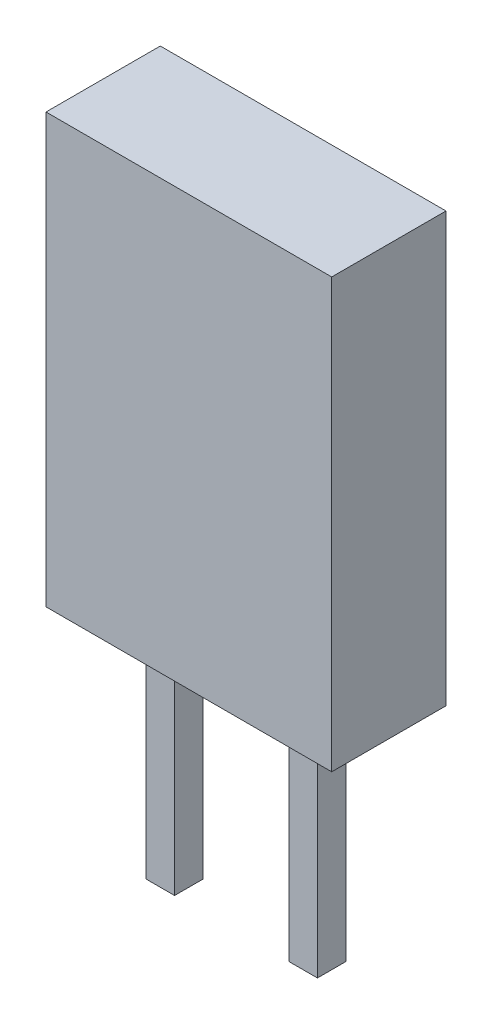
ISO-10303-21;
HEADER;
FILE_DESCRIPTION(('STEP AP214'),'2;1');
FILE_NAME('part.step','',(''),(''),'','','');
FILE_SCHEMA(('AUTOMOTIVE_DESIGN { 1 0 10303 214 1 1 1 1 }'));
ENDSEC;
DATA;
#1=APPLICATION_CONTEXT('core data for automotive mechanical design processes');
#2=APPLICATION_PROTOCOL_DEFINITION('international standard','automotive_design',2000,#1);
#3=PRODUCT_CONTEXT('',#1,'mechanical');
#4=PRODUCT('Part','Part','',(#3));
#5=PRODUCT_RELATED_PRODUCT_CATEGORY('part','',(#4));
#6=PRODUCT_DEFINITION_FORMATION('','',#4);
#7=PRODUCT_DEFINITION_CONTEXT('part definition',#1,'design');
#8=PRODUCT_DEFINITION('design','',#6,#7);
#9=PRODUCT_DEFINITION_SHAPE('','',#8);
#10=(LENGTH_UNIT() NAMED_UNIT(*) SI_UNIT(.MILLI.,.METRE.));
#11=(NAMED_UNIT(*) PLANE_ANGLE_UNIT() SI_UNIT($,.RADIAN.));
#12=(NAMED_UNIT(*) SI_UNIT($,.STERADIAN.) SOLID_ANGLE_UNIT());
#13=UNCERTAINTY_MEASURE_WITH_UNIT(LENGTH_MEASURE(1.E-05),#10,'distance_accuracy_value','');
#14=(GEOMETRIC_REPRESENTATION_CONTEXT(3) GLOBAL_UNCERTAINTY_ASSIGNED_CONTEXT((#13)) GLOBAL_UNIT_ASSIGNED_CONTEXT((#10,
#11,#12)) REPRESENTATION_CONTEXT('',''));
#15=CARTESIAN_POINT('',(0.,0.,0.));
#16=DIRECTION('',(0.,0.,1.));
#17=DIRECTION('',(1.,0.,0.));
#18=AXIS2_PLACEMENT_3D('',#15,#16,#17);
#19=CARTESIAN_POINT('',(-0.2,-1.75,0.25));
#20=DIRECTION('',(-0.876215908676647,-0.481918749772156,0.));
#21=DIRECTION('',(0.481918749772156,-0.876215908676647,0.));
#22=AXIS2_PLACEMENT_3D('',#19,#20,#21);
#23=PLANE('',#22);
#24=DIRECTION('',(-0.481918749772156,0.876215908676647,0.));
#25=VECTOR('',#24,1.);
#26=CARTESIAN_POINT('',(-0.2,-1.75,-0.25));
#27=LINE('',#26,#25);
#28=CARTESIAN_POINT('',(-0.2,-1.75,-0.25));
#29=VERTEX_POINT('',#28);
#30=CARTESIAN_POINT('',(-1.3,0.249999999999999,-0.25));
#31=VERTEX_POINT('',#30);
#32=EDGE_CURVE('E146',#29,#31,#27,.T.);
#33=ORIENTED_EDGE('',*,*,#32,.T.);
#34=DIRECTION('',(0.,0.,-1.));
#35=VECTOR('',#34,1.);
#36=CARTESIAN_POINT('',(-1.3,0.249999999999999,0.25));
#37=LINE('',#36,#35);
#38=CARTESIAN_POINT('',(-1.3,0.249999999999999,0.25));
#39=VERTEX_POINT('',#38);
#40=EDGE_CURVE('E128',#39,#31,#37,.T.);
#41=ORIENTED_EDGE('',*,*,#40,.F.);
#42=DIRECTION('',(-0.481918749772156,0.876215908676647,0.));
#43=VECTOR('',#42,1.);
#44=CARTESIAN_POINT('',(-0.2,-1.75,0.25));
#45=LINE('',#44,#43);
#46=CARTESIAN_POINT('',(-0.2,-1.75,0.25));
#47=VERTEX_POINT('',#46);
#48=EDGE_CURVE('E134',#47,#39,#45,.T.);
#49=ORIENTED_EDGE('',*,*,#48,.F.);
#50=DIRECTION('',(0.,0.,-1.));
#51=VECTOR('',#50,1.);
#52=CARTESIAN_POINT('',(-0.2,-1.75,0.25));
#53=LINE('',#52,#51);
#54=EDGE_CURVE('E190',#47,#29,#53,.T.);
#55=ORIENTED_EDGE('',*,*,#54,.T.);
#56=EDGE_LOOP('',(#33,#41,#49,#55));
#57=FACE_BOUND('',#56,.T.);
#58=ADVANCED_FACE('F46',(#57),#23,.F.);
#59=CARTESIAN_POINT('',(-1.3,0.249999999999999,0.25));
#60=DIRECTION('',(1.,0.,0.));
#61=DIRECTION('',(0.,1.,0.));
#62=AXIS2_PLACEMENT_3D('',#59,#60,#61);
#63=PLANE('',#62);
#64=DIRECTION('',(0.,-1.,0.));
#65=VECTOR('',#64,1.);
#66=CARTESIAN_POINT('',(-1.3,0.249999999999999,-0.25));
#67=LINE('',#66,#65);
#68=CARTESIAN_POINT('',(-1.3,-1.66715728752538,-0.25));
#69=VERTEX_POINT('',#68);
#70=EDGE_CURVE('E199',#31,#69,#67,.T.);
#71=ORIENTED_EDGE('',*,*,#70,.T.);
#72=DIRECTION('',(0.,0.,-1.));
#73=VECTOR('',#72,1.);
#74=CARTESIAN_POINT('',(-1.3,-1.66715728752538,0.25));
#75=LINE('',#74,#73);
#76=CARTESIAN_POINT('',(-1.3,-1.66715728752538,0.25));
#77=VERTEX_POINT('',#76);
#78=EDGE_CURVE('E131',#69,#77,#75,.F.);
#79=ORIENTED_EDGE('',*,*,#78,.T.);
#80=DIRECTION('',(0.,-1.,0.));
#81=VECTOR('',#80,1.);
#82=CARTESIAN_POINT('',(-1.3,0.249999999999999,0.25));
#83=LINE('',#82,#81);
#84=EDGE_CURVE('E123',#39,#77,#83,.T.);
#85=ORIENTED_EDGE('',*,*,#84,.F.);
#86=ORIENTED_EDGE('',*,*,#40,.T.);
#87=EDGE_LOOP('',(#71,#79,#85,#86));
#88=FACE_BOUND('',#87,.T.);
#89=ADVANCED_FACE('F126',(#88),#63,.F.);
#90=CARTESIAN_POINT('',(-1.3,-1.75,0.25));
#91=DIRECTION('',(0.707106781186548,-0.707106781186547,0.));
#92=DIRECTION('',(0.707106781186547,0.707106781186548,0.));
#93=AXIS2_PLACEMENT_3D('',#90,#91,#92);
#94=PLANE('',#93);
#95=DIRECTION('',(-0.707106781186547,-0.707106781186548,0.));
#96=VECTOR('',#95,1.);
#97=CARTESIAN_POINT('',(-1.3,-1.75,0.25));
#98=LINE('',#97,#96);
#99=CARTESIAN_POINT('',(-1.35857864376269,-1.80857864376269,0.25));
#100=VERTEX_POINT('',#99);
#101=CARTESIAN_POINT('',(-1.44142135623731,-1.89142135623731,0.25));
#102=VERTEX_POINT('',#101);
#103=EDGE_CURVE('E133',#100,#102,#98,.T.);
#104=ORIENTED_EDGE('',*,*,#103,.F.);
#105=DIRECTION('',(0.,0.,-1.));
#106=VECTOR('',#105,1.);
#107=CARTESIAN_POINT('',(-1.35857864376269,-1.80857864376269,-0.25));
#108=LINE('',#107,#106);
#109=CARTESIAN_POINT('',(-1.35857864376269,-1.80857864376269,-0.25));
#110=VERTEX_POINT('',#109);
#111=EDGE_CURVE('E150',#100,#110,#108,.T.);
#112=ORIENTED_EDGE('',*,*,#111,.T.);
#113=DIRECTION('',(-0.707106781186547,-0.707106781186548,0.));
#114=VECTOR('',#113,1.);
#115=CARTESIAN_POINT('',(-1.3,-1.75,-0.25));
#116=LINE('',#115,#114);
#117=CARTESIAN_POINT('',(-1.44142135623731,-1.89142135623731,-0.25));
#118=VERTEX_POINT('',#117);
#119=EDGE_CURVE('E201',#110,#118,#116,.T.);
#120=ORIENTED_EDGE('',*,*,#119,.T.);
#121=DIRECTION('',(0.,0.,-1.));
#122=VECTOR('',#121,1.);
#123=CARTESIAN_POINT('',(-1.44142135623731,-1.89142135623731,0.25));
#124=LINE('',#123,#122);
#125=EDGE_CURVE('E147',#118,#102,#124,.F.);
#126=ORIENTED_EDGE('',*,*,#125,.T.);
#127=EDGE_LOOP('',(#104,#112,#120,#126));
#128=FACE_BOUND('',#127,.T.);
#129=ADVANCED_FACE('F223',(#128),#94,.F.);
#130=CARTESIAN_POINT('',(-1.5,-3.75,0.25));
#131=DIRECTION('',(1.,0.,0.));
#132=DIRECTION('',(0.,1.,0.));
#133=AXIS2_PLACEMENT_3D('',#130,#131,#132);
#134=PLANE('',#133);
#135=DIRECTION('',(0.,-1.,0.));
#136=VECTOR('',#135,1.);
#137=CARTESIAN_POINT('',(-1.5,-1.95,0.25));
#138=LINE('',#137,#136);
#139=CARTESIAN_POINT('',(-1.5,-2.03284271247462,0.25));
#140=VERTEX_POINT('',#139);
#141=CARTESIAN_POINT('',(-1.5,-7.75,0.25));
#142=VERTEX_POINT('',#141);
#143=EDGE_CURVE('E216',#140,#142,#138,.T.);
#144=ORIENTED_EDGE('',*,*,#143,.F.);
#145=DIRECTION('',(0.,0.,-1.));
#146=VECTOR('',#145,1.);
#147=CARTESIAN_POINT('',(-1.5,-2.03284271247462,0.25));
#148=LINE('',#147,#146);
#149=CARTESIAN_POINT('',(-1.5,-2.03284271247462,-0.25));
#150=VERTEX_POINT('',#149);
#151=EDGE_CURVE('E160',#140,#150,#148,.T.);
#152=ORIENTED_EDGE('',*,*,#151,.T.);
#153=DIRECTION('',(0.,-1.,0.));
#154=VECTOR('',#153,1.);
#155=CARTESIAN_POINT('',(-1.5,-3.75,-0.25));
#156=LINE('',#155,#154);
#157=CARTESIAN_POINT('',(-1.5,-7.75,-0.25));
#158=VERTEX_POINT('',#157);
#159=EDGE_CURVE('E204',#150,#158,#156,.T.);
#160=ORIENTED_EDGE('',*,*,#159,.T.);
#161=DIRECTION('',(0.,0.,-1.));
#162=VECTOR('',#161,1.);
#163=CARTESIAN_POINT('',(-1.5,-7.75,0.25));
#164=LINE('',#163,#162);
#165=EDGE_CURVE('E148',#142,#158,#164,.T.);
#166=ORIENTED_EDGE('',*,*,#165,.F.);
#167=EDGE_LOOP('',(#144,#152,#160,#166));
#168=FACE_BOUND('',#167,.T.);
#169=ADVANCED_FACE('F214',(#168),#134,.F.);
#170=CARTESIAN_POINT('',(-1.5,-7.75,0.25));
#171=DIRECTION('',(0.,1.,0.));
#172=DIRECTION('',(0.,0.,1.));
#173=AXIS2_PLACEMENT_3D('',#170,#171,#172);
#174=PLANE('',#173);
#175=DIRECTION('',(1.,0.,0.));
#176=VECTOR('',#175,1.);
#177=CARTESIAN_POINT('',(-1.5,-7.75,-0.25));
#178=LINE('',#177,#176);
#179=CARTESIAN_POINT('',(-0.999999999999999,-7.75,-0.25));
#180=VERTEX_POINT('',#179);
#181=EDGE_CURVE('E186',#158,#180,#178,.T.);
#182=ORIENTED_EDGE('',*,*,#181,.T.);
#183=DIRECTION('',(0.,0.,-1.));
#184=VECTOR('',#183,1.);
#185=CARTESIAN_POINT('',(-0.999999999999999,-7.75,0.25));
#186=LINE('',#185,#184);
#187=CARTESIAN_POINT('',(-0.999999999999999,-7.75,0.25));
#188=VERTEX_POINT('',#187);
#189=EDGE_CURVE('E153',#188,#180,#186,.T.);
#190=ORIENTED_EDGE('',*,*,#189,.F.);
#191=DIRECTION('',(1.,0.,0.));
#192=VECTOR('',#191,1.);
#193=CARTESIAN_POINT('',(-1.5,-7.75,0.25));
#194=LINE('',#193,#192);
#195=EDGE_CURVE('E194',#142,#188,#194,.T.);
#196=ORIENTED_EDGE('',*,*,#195,.F.);
#197=ORIENTED_EDGE('',*,*,#165,.T.);
#198=EDGE_LOOP('',(#182,#190,#196,#197));
#199=FACE_BOUND('',#198,.T.);
#200=ADVANCED_FACE('F208',(#199),#174,.F.);
#201=CARTESIAN_POINT('',(-1.,-3.75,0.25));
#202=DIRECTION('',(-1.,0.,0.));
#203=DIRECTION('',(0.,-1.,0.));
#204=AXIS2_PLACEMENT_3D('',#201,#202,#203);
#205=PLANE('',#204);
#206=DIRECTION('',(0.,1.,0.));
#207=VECTOR('',#206,1.);
#208=CARTESIAN_POINT('',(-1.,-3.75,-0.25));
#209=LINE('',#208,#207);
#210=CARTESIAN_POINT('',(-0.999999999999999,-2.10615528128088,-0.25));
#211=VERTEX_POINT('',#210);
#212=EDGE_CURVE('E179',#180,#211,#209,.T.);
#213=ORIENTED_EDGE('',*,*,#212,.T.);
#214=DIRECTION('',(0.,0.,-1.));
#215=VECTOR('',#214,1.);
#216=CARTESIAN_POINT('',(-0.999999999999999,-2.10615528128088,0.25));
#217=LINE('',#216,#215);
#218=CARTESIAN_POINT('',(-1.,-2.10615528128088,0.25));
#219=VERTEX_POINT('',#218);
#220=EDGE_CURVE('E67',#211,#219,#217,.F.);
#221=ORIENTED_EDGE('',*,*,#220,.T.);
#222=DIRECTION('',(0.,1.,0.));
#223=VECTOR('',#222,1.);
#224=CARTESIAN_POINT('',(-0.999999999999999,-7.75,0.25));
#225=LINE('',#224,#223);
#226=EDGE_CURVE('E191',#188,#219,#225,.T.);
#227=ORIENTED_EDGE('',*,*,#226,.F.);
#228=ORIENTED_EDGE('',*,*,#189,.T.);
#229=EDGE_LOOP('',(#213,#221,#227,#228));
#230=FACE_BOUND('',#229,.T.);
#231=ADVANCED_FACE('F184',(#230),#205,.F.);
#232=CARTESIAN_POINT('',(-0.999999999999999,-1.95,0.25));
#233=DIRECTION('',(-0.242535625036333,0.970142500145332,0.));
#234=DIRECTION('',(-0.970142500145332,-0.242535625036333,0.));
#235=AXIS2_PLACEMENT_3D('',#232,#233,#234);
#236=PLANE('',#235);
#237=DIRECTION('',(0.970142500145332,0.242535625036333,0.));
#238=VECTOR('',#237,1.);
#239=CARTESIAN_POINT('',(-0.999999999999999,-1.95,0.25));
#240=LINE('',#239,#238);
#241=CARTESIAN_POINT('',(-0.848507125007266,-1.91212678125182,0.25));
#242=VERTEX_POINT('',#241);
#243=EDGE_CURVE('E139',#242,#47,#240,.T.);
#244=ORIENTED_EDGE('',*,*,#243,.F.);
#245=DIRECTION('',(0.,0.,-1.));
#246=VECTOR('',#245,1.);
#247=CARTESIAN_POINT('',(-0.848507125007266,-1.91212678125182,-0.25));
#248=LINE('',#247,#246);
#249=CARTESIAN_POINT('',(-0.848507125007266,-1.91212678125182,-0.25));
#250=VERTEX_POINT('',#249);
#251=EDGE_CURVE('E167',#242,#250,#248,.T.);
#252=ORIENTED_EDGE('',*,*,#251,.T.);
#253=DIRECTION('',(0.970142500145332,0.242535625036333,0.));
#254=VECTOR('',#253,1.);
#255=CARTESIAN_POINT('',(-0.999999999999999,-1.95,-0.25));
#256=LINE('',#255,#254);
#257=EDGE_CURVE('E143',#250,#29,#256,.T.);
#258=ORIENTED_EDGE('',*,*,#257,.T.);
#259=ORIENTED_EDGE('',*,*,#54,.F.);
#260=EDGE_LOOP('',(#244,#252,#258,#259));
#261=FACE_BOUND('',#260,.T.);
#262=ADVANCED_FACE('F189',(#261),#236,.F.);
#263=CARTESIAN_POINT('',(0.,0.,0.25));
#264=DIRECTION('',(0.,0.,-1.));
#265=DIRECTION('',(-1.,0.,0.));
#266=AXIS2_PLACEMENT_3D('',#263,#264,#265);
#267=PLANE('',#266);
#268=ORIENTED_EDGE('',*,*,#103,.T.);
#269=CARTESIAN_POINT('',(-1.3,-2.03284271247462,0.25));
#270=DIRECTION('',(0.,0.,-1.));
#271=DIRECTION('',(-1.,0.,0.));
#272=AXIS2_PLACEMENT_3D('',#269,#270,#271);
#273=CIRCLE('',#272,0.2);
#274=EDGE_CURVE('E165',#102,#140,#273,.F.);
#275=ORIENTED_EDGE('',*,*,#274,.T.);
#276=ORIENTED_EDGE('',*,*,#143,.T.);
#277=ORIENTED_EDGE('',*,*,#195,.T.);
#278=ORIENTED_EDGE('',*,*,#226,.T.);
#279=CARTESIAN_POINT('',(-0.799999999999999,-2.10615528128088,0.25));
#280=DIRECTION('',(0.,0.,-1.));
#281=DIRECTION('',(-1.,0.,0.));
#282=AXIS2_PLACEMENT_3D('',#279,#280,#281);
#283=CIRCLE('',#282,0.2);
#284=EDGE_CURVE('E12',#219,#242,#283,.T.);
#285=ORIENTED_EDGE('',*,*,#284,.T.);
#286=ORIENTED_EDGE('',*,*,#243,.T.);
#287=ORIENTED_EDGE('',*,*,#48,.T.);
#288=ORIENTED_EDGE('',*,*,#84,.T.);
#289=CARTESIAN_POINT('',(-1.5,-1.66715728752538,0.25));
#290=DIRECTION('',(0.,0.,-1.));
#291=DIRECTION('',(-1.,0.,0.));
#292=AXIS2_PLACEMENT_3D('',#289,#290,#291);
#293=CIRCLE('',#292,0.2);
#294=EDGE_CURVE('E173',#77,#100,#293,.T.);
#295=ORIENTED_EDGE('',*,*,#294,.T.);
#296=EDGE_LOOP('',(#268,#275,#276,#277,#278,#285,#286,#287,#288,#295));
#297=FACE_BOUND('',#296,.T.);
#298=ADVANCED_FACE('F138',(#297),#267,.F.);
#299=CARTESIAN_POINT('',(0.,0.,-0.25));
#300=DIRECTION('',(0.,0.,-1.));
#301=DIRECTION('',(-1.,0.,0.));
#302=AXIS2_PLACEMENT_3D('',#299,#300,#301);
#303=PLANE('',#302);
#304=ORIENTED_EDGE('',*,*,#159,.F.);
#305=CARTESIAN_POINT('',(-1.3,-2.03284271247462,-0.25));
#306=DIRECTION('',(0.,0.,-1.));
#307=DIRECTION('',(-1.,0.,0.));
#308=AXIS2_PLACEMENT_3D('',#305,#306,#307);
#309=CIRCLE('',#308,0.2);
#310=EDGE_CURVE('E163',#150,#118,#309,.T.);
#311=ORIENTED_EDGE('',*,*,#310,.T.);
#312=ORIENTED_EDGE('',*,*,#119,.F.);
#313=CARTESIAN_POINT('',(-1.5,-1.66715728752538,-0.25));
#314=DIRECTION('',(0.,0.,-1.));
#315=DIRECTION('',(-1.,0.,0.));
#316=AXIS2_PLACEMENT_3D('',#313,#314,#315);
#317=CIRCLE('',#316,0.2);
#318=EDGE_CURVE('E171',#110,#69,#317,.F.);
#319=ORIENTED_EDGE('',*,*,#318,.T.);
#320=ORIENTED_EDGE('',*,*,#70,.F.);
#321=ORIENTED_EDGE('',*,*,#32,.F.);
#322=ORIENTED_EDGE('',*,*,#257,.F.);
#323=CARTESIAN_POINT('',(-0.799999999999999,-2.10615528128088,-0.25));
#324=DIRECTION('',(0.,0.,-1.));
#325=DIRECTION('',(-1.,0.,0.));
#326=AXIS2_PLACEMENT_3D('',#323,#324,#325);
#327=CIRCLE('',#326,0.2);
#328=EDGE_CURVE('E54',#250,#211,#327,.F.);
#329=ORIENTED_EDGE('',*,*,#328,.T.);
#330=ORIENTED_EDGE('',*,*,#212,.F.);
#331=ORIENTED_EDGE('',*,*,#181,.F.);
#332=EDGE_LOOP('',(#304,#311,#312,#319,#320,#321,#322,#329,#330,#331));
#333=FACE_BOUND('',#332,.T.);
#334=ADVANCED_FACE('F177',(#333),#303,.T.);
#335=CARTESIAN_POINT('',(-1.5,-1.66715728752538,0.25));
#336=DIRECTION('',(0.,0.,1.));
#337=DIRECTION('',(1.,0.,0.));
#338=AXIS2_PLACEMENT_3D('',#335,#336,#337);
#339=CYLINDRICAL_SURFACE('',#338,0.2);
#340=ORIENTED_EDGE('',*,*,#294,.F.);
#341=ORIENTED_EDGE('',*,*,#78,.F.);
#342=ORIENTED_EDGE('',*,*,#318,.F.);
#343=ORIENTED_EDGE('',*,*,#111,.F.);
#344=EDGE_LOOP('',(#340,#341,#342,#343));
#345=FACE_BOUND('',#344,.T.);
#346=ADVANCED_FACE('F228',(#345),#339,.F.);
#347=CARTESIAN_POINT('',(-1.3,-2.03284271247462,0.25));
#348=DIRECTION('',(0.,0.,-1.));
#349=DIRECTION('',(-1.,0.,0.));
#350=AXIS2_PLACEMENT_3D('',#347,#348,#349);
#351=CYLINDRICAL_SURFACE('',#350,0.2);
#352=ORIENTED_EDGE('',*,*,#274,.F.);
#353=ORIENTED_EDGE('',*,*,#125,.F.);
#354=ORIENTED_EDGE('',*,*,#310,.F.);
#355=ORIENTED_EDGE('',*,*,#151,.F.);
#356=EDGE_LOOP('',(#352,#353,#354,#355));
#357=FACE_BOUND('',#356,.T.);
#358=ADVANCED_FACE('F219',(#357),#351,.T.);
#359=CARTESIAN_POINT('',(-0.799999999999999,-2.10615528128088,0.25));
#360=DIRECTION('',(0.,0.,1.));
#361=DIRECTION('',(1.,0.,0.));
#362=AXIS2_PLACEMENT_3D('',#359,#360,#361);
#363=CYLINDRICAL_SURFACE('',#362,0.2);
#364=ORIENTED_EDGE('',*,*,#284,.F.);
#365=ORIENTED_EDGE('',*,*,#220,.F.);
#366=ORIENTED_EDGE('',*,*,#328,.F.);
#367=ORIENTED_EDGE('',*,*,#251,.F.);
#368=EDGE_LOOP('',(#364,#365,#366,#367));
#369=FACE_BOUND('',#368,.T.);
#370=ADVANCED_FACE('F48',(#369),#363,.F.);
#371=CLOSED_SHELL('',(#58,#89,#129,#169,#200,#231,#262,#298,#334,#346,#358,#370));
#372=MANIFOLD_SOLID_BREP('B2',#371);
#373=CARTESIAN_POINT('',(1.5,-3.75,0.25));
#374=DIRECTION('',(-1.,0.,0.));
#375=DIRECTION('',(0.,-1.,0.));
#376=AXIS2_PLACEMENT_3D('',#373,#374,#375);
#377=PLANE('',#376);
#378=DIRECTION('',(0.,1.,0.));
#379=VECTOR('',#378,1.);
#380=CARTESIAN_POINT('',(1.5,-3.75,-0.25));
#381=LINE('',#380,#379);
#382=CARTESIAN_POINT('',(1.5,-7.75,-0.25));
#383=VERTEX_POINT('',#382);
#384=CARTESIAN_POINT('',(1.5,-2.03284271247462,-0.25));
#385=VERTEX_POINT('',#384);
#386=EDGE_CURVE('E463',#383,#385,#381,.T.);
#387=ORIENTED_EDGE('',*,*,#386,.T.);
#388=DIRECTION('',(0.,0.,-1.));
#389=VECTOR('',#388,1.);
#390=CARTESIAN_POINT('',(1.5,-2.03284271247462,0.25));
#391=LINE('',#390,#389);
#392=CARTESIAN_POINT('',(1.5,-2.03284271247462,0.25));
#393=VERTEX_POINT('',#392);
#394=EDGE_CURVE('E511',#385,#393,#391,.F.);
#395=ORIENTED_EDGE('',*,*,#394,.T.);
#396=DIRECTION('',(0.,1.,0.));
#397=VECTOR('',#396,1.);
#398=CARTESIAN_POINT('',(1.5,-7.75,0.25));
#399=LINE('',#398,#397);
#400=CARTESIAN_POINT('',(1.5,-7.75,0.25));
#401=VERTEX_POINT('',#400);
#402=EDGE_CURVE('E483',#401,#393,#399,.T.);
#403=ORIENTED_EDGE('',*,*,#402,.F.);
#404=DIRECTION('',(0.,0.,-1.));
#405=VECTOR('',#404,1.);
#406=CARTESIAN_POINT('',(1.5,-7.75,0.25));
#407=LINE('',#406,#405);
#408=EDGE_CURVE('E462',#401,#383,#407,.T.);
#409=ORIENTED_EDGE('',*,*,#408,.T.);
#410=EDGE_LOOP('',(#387,#395,#403,#409));
#411=FACE_BOUND('',#410,.T.);
#412=ADVANCED_FACE('F341',(#411),#377,.F.);
#413=CARTESIAN_POINT('',(1.3,-1.75,0.25));
#414=DIRECTION('',(-0.707106781186547,-0.707106781186547,0.));
#415=DIRECTION('',(0.707106781186548,-0.707106781186548,0.));
#416=AXIS2_PLACEMENT_3D('',#413,#414,#415);
#417=PLANE('',#416);
#418=DIRECTION('',(-0.707106781186548,0.707106781186548,0.));
#419=VECTOR('',#418,1.);
#420=CARTESIAN_POINT('',(1.3,-1.75,-0.25));
#421=LINE('',#420,#419);
#422=CARTESIAN_POINT('',(1.44142135623731,-1.89142135623731,-0.25));
#423=VERTEX_POINT('',#422);
#424=CARTESIAN_POINT('',(1.35857864376269,-1.80857864376269,-0.25));
#425=VERTEX_POINT('',#424);
#426=EDGE_CURVE('E466',#423,#425,#421,.T.);
#427=ORIENTED_EDGE('',*,*,#426,.T.);
#428=DIRECTION('',(0.,0.,-1.));
#429=VECTOR('',#428,1.);
#430=CARTESIAN_POINT('',(1.35857864376269,-1.80857864376269,0.25));
#431=LINE('',#430,#429);
#432=CARTESIAN_POINT('',(1.35857864376269,-1.80857864376269,0.25));
#433=VERTEX_POINT('',#432);
#434=EDGE_CURVE('E509',#425,#433,#431,.F.);
#435=ORIENTED_EDGE('',*,*,#434,.T.);
#436=DIRECTION('',(-0.707106781186548,0.707106781186548,0.));
#437=VECTOR('',#436,1.);
#438=CARTESIAN_POINT('',(1.3,-1.75,0.25));
#439=LINE('',#438,#437);
#440=CARTESIAN_POINT('',(1.44142135623731,-1.89142135623731,0.25));
#441=VERTEX_POINT('',#440);
#442=EDGE_CURVE('E436',#441,#433,#439,.T.);
#443=ORIENTED_EDGE('',*,*,#442,.F.);
#444=DIRECTION('',(0.,0.,-1.));
#445=VECTOR('',#444,1.);
#446=CARTESIAN_POINT('',(1.44142135623731,-1.89142135623731,0.25));
#447=LINE('',#446,#445);
#448=EDGE_CURVE('E506',#441,#423,#447,.T.);
#449=ORIENTED_EDGE('',*,*,#448,.T.);
#450=EDGE_LOOP('',(#427,#435,#443,#449));
#451=FACE_BOUND('',#450,.T.);
#452=ADVANCED_FACE('F568',(#451),#417,.F.);
#453=CARTESIAN_POINT('',(1.3,-1.75,0.25));
#454=DIRECTION('',(-1.,0.,0.));
#455=DIRECTION('',(0.,0.,1.));
#456=AXIS2_PLACEMENT_3D('',#453,#454,#455);
#457=PLANE('',#456);
#458=DIRECTION('',(0.,1.,0.));
#459=VECTOR('',#458,1.);
#460=CARTESIAN_POINT('',(1.3,-1.75,0.25));
#461=LINE('',#460,#459);
#462=CARTESIAN_POINT('',(1.3,-1.66715728752538,0.25));
#463=VERTEX_POINT('',#462);
#464=CARTESIAN_POINT('',(1.3,0.25,0.25));
#465=VERTEX_POINT('',#464);
#466=EDGE_CURVE('E426',#463,#465,#461,.T.);
#467=ORIENTED_EDGE('',*,*,#466,.F.);
#468=DIRECTION('',(0.,0.,-1.));
#469=VECTOR('',#468,1.);
#470=CARTESIAN_POINT('',(1.3,-1.66715728752538,-0.25));
#471=LINE('',#470,#469);
#472=CARTESIAN_POINT('',(1.3,-1.66715728752538,-0.25));
#473=VERTEX_POINT('',#472);
#474=EDGE_CURVE('E504',#463,#473,#471,.T.);
#475=ORIENTED_EDGE('',*,*,#474,.T.);
#476=DIRECTION('',(0.,1.,0.));
#477=VECTOR('',#476,1.);
#478=CARTESIAN_POINT('',(1.3,-1.75,-0.25));
#479=LINE('',#478,#477);
#480=CARTESIAN_POINT('',(1.3,0.25,-0.25));
#481=VERTEX_POINT('',#480);
#482=EDGE_CURVE('E442',#473,#481,#479,.T.);
#483=ORIENTED_EDGE('',*,*,#482,.T.);
#484=DIRECTION('',(0.,0.,-1.));
#485=VECTOR('',#484,1.);
#486=CARTESIAN_POINT('',(1.3,0.25,0.25));
#487=LINE('',#486,#485);
#488=EDGE_CURVE('E439',#465,#481,#487,.T.);
#489=ORIENTED_EDGE('',*,*,#488,.F.);
#490=EDGE_LOOP('',(#467,#475,#483,#489));
#491=FACE_BOUND('',#490,.T.);
#492=ADVANCED_FACE('F440',(#491),#457,.F.);
#493=CARTESIAN_POINT('',(1.3,0.25,0.25));
#494=DIRECTION('',(0.,-1.,0.));
#495=DIRECTION('',(1.,0.,0.));
#496=AXIS2_PLACEMENT_3D('',#493,#494,#495);
#497=PLANE('',#496);
#498=DIRECTION('',(-1.,0.,0.));
#499=VECTOR('',#498,1.);
#500=CARTESIAN_POINT('',(1.3,0.25,-0.25));
#501=LINE('',#500,#499);
#502=CARTESIAN_POINT('',(-1.2,0.249999999999999,-0.25));
#503=VERTEX_POINT('',#502);
#504=EDGE_CURVE('E470',#481,#503,#501,.T.);
#505=ORIENTED_EDGE('',*,*,#504,.T.);
#506=DIRECTION('',(0.,0.,-1.));
#507=VECTOR('',#506,1.);
#508=CARTESIAN_POINT('',(-1.2,0.249999999999999,0.25));
#509=LINE('',#508,#507);
#510=CARTESIAN_POINT('',(-1.2,0.249999999999999,0.25));
#511=VERTEX_POINT('',#510);
#512=EDGE_CURVE('E446',#511,#503,#509,.T.);
#513=ORIENTED_EDGE('',*,*,#512,.F.);
#514=DIRECTION('',(-1.,0.,0.));
#515=VECTOR('',#514,1.);
#516=CARTESIAN_POINT('',(1.3,0.25,0.25));
#517=LINE('',#516,#515);
#518=EDGE_CURVE('E431',#465,#511,#517,.T.);
#519=ORIENTED_EDGE('',*,*,#518,.F.);
#520=ORIENTED_EDGE('',*,*,#488,.T.);
#521=EDGE_LOOP('',(#505,#513,#519,#520));
#522=FACE_BOUND('',#521,.T.);
#523=ADVANCED_FACE('F448',(#522),#497,.F.);
#524=CARTESIAN_POINT('',(-1.2,0.249999999999999,0.25));
#525=DIRECTION('',(0.791285001392167,0.611447501075766,0.));
#526=DIRECTION('',(-0.611447501075766,0.791285001392167,0.));
#527=AXIS2_PLACEMENT_3D('',#524,#525,#526);
#528=PLANE('',#527);
#529=DIRECTION('',(0.611447501075766,-0.791285001392167,0.));
#530=VECTOR('',#529,1.);
#531=CARTESIAN_POINT('',(-1.2,0.249999999999999,-0.25));
#532=LINE('',#531,#530);
#533=CARTESIAN_POINT('',(0.439950977438983,-1.87228950021515,-0.25));
#534=VERTEX_POINT('',#533);
#535=EDGE_CURVE('E472',#503,#534,#532,.T.);
#536=ORIENTED_EDGE('',*,*,#535,.T.);
#537=DIRECTION('',(0.,0.,-1.));
#538=VECTOR('',#537,1.);
#539=CARTESIAN_POINT('',(0.439950977438983,-1.87228950021515,0.25));
#540=LINE('',#539,#538);
#541=CARTESIAN_POINT('',(0.439950977438983,-1.87228950021515,0.25));
#542=VERTEX_POINT('',#541);
#543=EDGE_CURVE('E498',#534,#542,#540,.F.);
#544=ORIENTED_EDGE('',*,*,#543,.T.);
#545=DIRECTION('',(0.611447501075766,-0.791285001392167,0.));
#546=VECTOR('',#545,1.);
#547=CARTESIAN_POINT('',(-1.2,0.249999999999999,0.25));
#548=LINE('',#547,#546);
#549=EDGE_CURVE('E451',#511,#542,#548,.T.);
#550=ORIENTED_EDGE('',*,*,#549,.F.);
#551=ORIENTED_EDGE('',*,*,#512,.T.);
#552=EDGE_LOOP('',(#536,#544,#550,#551));
#553=FACE_BOUND('',#552,.T.);
#554=ADVANCED_FACE('F552',(#553),#528,.F.);
#555=CARTESIAN_POINT('',(0.5,-1.95,0.25));
#556=DIRECTION('',(0.,1.,0.));
#557=DIRECTION('',(0.,0.,1.));
#558=AXIS2_PLACEMENT_3D('',#555,#556,#557);
#559=PLANE('',#558);
#560=DIRECTION('',(1.,0.,0.));
#561=VECTOR('',#560,1.);
#562=CARTESIAN_POINT('',(0.5,-1.95,0.25));
#563=LINE('',#562,#561);
#564=CARTESIAN_POINT('',(0.598207977717416,-1.95,0.25));
#565=VERTEX_POINT('',#564);
#566=CARTESIAN_POINT('',(0.8,-1.95,0.25));
#567=VERTEX_POINT('',#566);
#568=EDGE_CURVE('E453',#565,#567,#563,.T.);
#569=ORIENTED_EDGE('',*,*,#568,.F.);
#570=DIRECTION('',(0.,0.,-1.));
#571=VECTOR('',#570,1.);
#572=CARTESIAN_POINT('',(0.598207977717416,-1.95,0.25));
#573=LINE('',#572,#571);
#574=CARTESIAN_POINT('',(0.598207977717416,-1.95,-0.25));
#575=VERTEX_POINT('',#574);
#576=EDGE_CURVE('E491',#565,#575,#573,.T.);
#577=ORIENTED_EDGE('',*,*,#576,.T.);
#578=DIRECTION('',(1.,0.,0.));
#579=VECTOR('',#578,1.);
#580=CARTESIAN_POINT('',(0.5,-1.95,-0.25));
#581=LINE('',#580,#579);
#582=CARTESIAN_POINT('',(0.8,-1.95,-0.25));
#583=VERTEX_POINT('',#582);
#584=EDGE_CURVE('E475',#575,#583,#581,.T.);
#585=ORIENTED_EDGE('',*,*,#584,.T.);
#586=DIRECTION('',(0.,0.,-1.));
#587=VECTOR('',#586,1.);
#588=CARTESIAN_POINT('',(0.8,-1.95,0.25));
#589=LINE('',#588,#587);
#590=EDGE_CURVE('E445',#583,#567,#589,.F.);
#591=ORIENTED_EDGE('',*,*,#590,.T.);
#592=EDGE_LOOP('',(#569,#577,#585,#591));
#593=FACE_BOUND('',#592,.T.);
#594=ADVANCED_FACE('F528',(#593),#559,.F.);
#595=CARTESIAN_POINT('',(1.,-3.75,0.25));
#596=DIRECTION('',(1.,0.,0.));
#597=DIRECTION('',(0.,1.,0.));
#598=AXIS2_PLACEMENT_3D('',#595,#596,#597);
#599=PLANE('',#598);
#600=DIRECTION('',(0.,-1.,0.));
#601=VECTOR('',#600,1.);
#602=CARTESIAN_POINT('',(1.,-1.95,0.25));
#603=LINE('',#602,#601);
#604=CARTESIAN_POINT('',(1.,-2.15,0.25));
#605=VERTEX_POINT('',#604);
#606=CARTESIAN_POINT('',(1.,-7.75,0.25));
#607=VERTEX_POINT('',#606);
#608=EDGE_CURVE('E458',#605,#607,#603,.T.);
#609=ORIENTED_EDGE('',*,*,#608,.F.);
#610=DIRECTION('',(0.,0.,-1.));
#611=VECTOR('',#610,1.);
#612=CARTESIAN_POINT('',(1.,-2.15,-0.25));
#613=LINE('',#612,#611);
#614=CARTESIAN_POINT('',(1.,-2.15,-0.25));
#615=VERTEX_POINT('',#614);
#616=EDGE_CURVE('E513',#605,#615,#613,.T.);
#617=ORIENTED_EDGE('',*,*,#616,.T.);
#618=DIRECTION('',(0.,-1.,0.));
#619=VECTOR('',#618,1.);
#620=CARTESIAN_POINT('',(1.,-3.75,-0.25));
#621=LINE('',#620,#619);
#622=CARTESIAN_POINT('',(1.,-7.75,-0.25));
#623=VERTEX_POINT('',#622);
#624=EDGE_CURVE('E478',#615,#623,#621,.T.);
#625=ORIENTED_EDGE('',*,*,#624,.T.);
#626=DIRECTION('',(0.,0.,-1.));
#627=VECTOR('',#626,1.);
#628=CARTESIAN_POINT('',(1.,-7.75,0.25));
#629=LINE('',#628,#627);
#630=EDGE_CURVE('E486',#607,#623,#629,.T.);
#631=ORIENTED_EDGE('',*,*,#630,.F.);
#632=EDGE_LOOP('',(#609,#617,#625,#631));
#633=FACE_BOUND('',#632,.T.);
#634=ADVANCED_FACE('F531',(#633),#599,.F.);
#635=CARTESIAN_POINT('',(1.,-7.75,0.25));
#636=DIRECTION('',(0.,1.,0.));
#637=DIRECTION('',(0.,0.,1.));
#638=AXIS2_PLACEMENT_3D('',#635,#636,#637);
#639=PLANE('',#638);
#640=DIRECTION('',(1.,0.,0.));
#641=VECTOR('',#640,1.);
#642=CARTESIAN_POINT('',(1.,-7.75,-0.25));
#643=LINE('',#642,#641);
#644=EDGE_CURVE('E480',#623,#383,#643,.T.);
#645=ORIENTED_EDGE('',*,*,#644,.T.);
#646=ORIENTED_EDGE('',*,*,#408,.F.);
#647=DIRECTION('',(1.,0.,0.));
#648=VECTOR('',#647,1.);
#649=CARTESIAN_POINT('',(1.,-7.75,0.25));
#650=LINE('',#649,#648);
#651=EDGE_CURVE('E460',#607,#401,#650,.T.);
#652=ORIENTED_EDGE('',*,*,#651,.F.);
#653=ORIENTED_EDGE('',*,*,#630,.T.);
#654=EDGE_LOOP('',(#645,#646,#652,#653));
#655=FACE_BOUND('',#654,.T.);
#656=ADVANCED_FACE('F539',(#655),#639,.F.);
#657=CARTESIAN_POINT('',(0.,0.,0.25));
#658=DIRECTION('',(0.,0.,1.));
#659=DIRECTION('',(1.,0.,0.));
#660=AXIS2_PLACEMENT_3D('',#657,#658,#659);
#661=PLANE('',#660);
#662=ORIENTED_EDGE('',*,*,#549,.T.);
#663=CARTESIAN_POINT('',(0.598207977717416,-1.75,0.25));
#664=DIRECTION('',(0.,0.,1.));
#665=DIRECTION('',(1.,0.,0.));
#666=AXIS2_PLACEMENT_3D('',#663,#664,#665);
#667=CIRCLE('',#666,0.2);
#668=EDGE_CURVE('E502',#542,#565,#667,.T.);
#669=ORIENTED_EDGE('',*,*,#668,.T.);
#670=ORIENTED_EDGE('',*,*,#568,.T.);
#671=CARTESIAN_POINT('',(0.8,-2.15,0.25));
#672=DIRECTION('',(0.,0.,1.));
#673=DIRECTION('',(1.,0.,0.));
#674=AXIS2_PLACEMENT_3D('',#671,#672,#673);
#675=CIRCLE('',#674,0.2);
#676=EDGE_CURVE('E44',#567,#605,#675,.F.);
#677=ORIENTED_EDGE('',*,*,#676,.T.);
#678=ORIENTED_EDGE('',*,*,#608,.T.);
#679=ORIENTED_EDGE('',*,*,#651,.T.);
#680=ORIENTED_EDGE('',*,*,#402,.T.);
#681=CARTESIAN_POINT('',(1.3,-2.03284271247462,0.25));
#682=DIRECTION('',(0.,0.,1.));
#683=DIRECTION('',(1.,0.,0.));
#684=AXIS2_PLACEMENT_3D('',#681,#682,#683);
#685=CIRCLE('',#684,0.2);
#686=EDGE_CURVE('E500',#393,#441,#685,.T.);
#687=ORIENTED_EDGE('',*,*,#686,.T.);
#688=ORIENTED_EDGE('',*,*,#442,.T.);
#689=CARTESIAN_POINT('',(1.5,-1.66715728752538,0.25));
#690=DIRECTION('',(0.,0.,1.));
#691=DIRECTION('',(1.,0.,0.));
#692=AXIS2_PLACEMENT_3D('',#689,#690,#691);
#693=CIRCLE('',#692,0.2);
#694=EDGE_CURVE('E361',#433,#463,#693,.F.);
#695=ORIENTED_EDGE('',*,*,#694,.T.);
#696=ORIENTED_EDGE('',*,*,#466,.T.);
#697=ORIENTED_EDGE('',*,*,#518,.T.);
#698=EDGE_LOOP('',(#662,#669,#670,#677,#678,#679,#680,#687,#688,#695,#696,#697));
#699=FACE_BOUND('',#698,.T.);
#700=ADVANCED_FACE('F429',(#699),#661,.T.);
#701=CARTESIAN_POINT('',(0.,0.,-0.25));
#702=DIRECTION('',(0.,0.,1.));
#703=DIRECTION('',(1.,0.,0.));
#704=AXIS2_PLACEMENT_3D('',#701,#702,#703);
#705=PLANE('',#704);
#706=ORIENTED_EDGE('',*,*,#584,.F.);
#707=CARTESIAN_POINT('',(0.598207977717416,-1.75,-0.25));
#708=DIRECTION('',(0.,0.,1.));
#709=DIRECTION('',(1.,0.,0.));
#710=AXIS2_PLACEMENT_3D('',#707,#708,#709);
#711=CIRCLE('',#710,0.2);
#712=EDGE_CURVE('E496',#575,#534,#711,.F.);
#713=ORIENTED_EDGE('',*,*,#712,.T.);
#714=ORIENTED_EDGE('',*,*,#535,.F.);
#715=ORIENTED_EDGE('',*,*,#504,.F.);
#716=ORIENTED_EDGE('',*,*,#482,.F.);
#717=CARTESIAN_POINT('',(1.5,-1.66715728752538,-0.25));
#718=DIRECTION('',(0.,0.,1.));
#719=DIRECTION('',(1.,0.,0.));
#720=AXIS2_PLACEMENT_3D('',#717,#718,#719);
#721=CIRCLE('',#720,0.2);
#722=EDGE_CURVE('E516',#473,#425,#721,.T.);
#723=ORIENTED_EDGE('',*,*,#722,.T.);
#724=ORIENTED_EDGE('',*,*,#426,.F.);
#725=CARTESIAN_POINT('',(1.3,-2.03284271247462,-0.25));
#726=DIRECTION('',(0.,0.,1.));
#727=DIRECTION('',(1.,0.,0.));
#728=AXIS2_PLACEMENT_3D('',#725,#726,#727);
#729=CIRCLE('',#728,0.2);
#730=EDGE_CURVE('E494',#423,#385,#729,.F.);
#731=ORIENTED_EDGE('',*,*,#730,.T.);
#732=ORIENTED_EDGE('',*,*,#386,.F.);
#733=ORIENTED_EDGE('',*,*,#644,.F.);
#734=ORIENTED_EDGE('',*,*,#624,.F.);
#735=CARTESIAN_POINT('',(0.8,-2.15,-0.25));
#736=DIRECTION('',(0.,0.,1.));
#737=DIRECTION('',(1.,0.,0.));
#738=AXIS2_PLACEMENT_3D('',#735,#736,#737);
#739=CIRCLE('',#738,0.2);
#740=EDGE_CURVE('E349',#615,#583,#739,.T.);
#741=ORIENTED_EDGE('',*,*,#740,.T.);
#742=EDGE_LOOP('',(#706,#713,#714,#715,#716,#723,#724,#731,#732,#733,#734,#741));
#743=FACE_BOUND('',#742,.T.);
#744=ADVANCED_FACE('F521',(#743),#705,.F.);
#745=CARTESIAN_POINT('',(0.598207977717416,-1.75,0.25));
#746=DIRECTION('',(0.,0.,-1.));
#747=DIRECTION('',(-1.,0.,0.));
#748=AXIS2_PLACEMENT_3D('',#745,#746,#747);
#749=CYLINDRICAL_SURFACE('',#748,0.2);
#750=ORIENTED_EDGE('',*,*,#668,.F.);
#751=ORIENTED_EDGE('',*,*,#543,.F.);
#752=ORIENTED_EDGE('',*,*,#712,.F.);
#753=ORIENTED_EDGE('',*,*,#576,.F.);
#754=EDGE_LOOP('',(#750,#751,#752,#753));
#755=FACE_BOUND('',#754,.T.);
#756=ADVANCED_FACE('F556',(#755),#749,.T.);
#757=CARTESIAN_POINT('',(1.5,-1.66715728752538,0.25));
#758=DIRECTION('',(0.,0.,1.));
#759=DIRECTION('',(1.,0.,0.));
#760=AXIS2_PLACEMENT_3D('',#757,#758,#759);
#761=CYLINDRICAL_SURFACE('',#760,0.2);
#762=ORIENTED_EDGE('',*,*,#694,.F.);
#763=ORIENTED_EDGE('',*,*,#434,.F.);
#764=ORIENTED_EDGE('',*,*,#722,.F.);
#765=ORIENTED_EDGE('',*,*,#474,.F.);
#766=EDGE_LOOP('',(#762,#763,#764,#765));
#767=FACE_BOUND('',#766,.T.);
#768=ADVANCED_FACE('F548',(#767),#761,.F.);
#769=CARTESIAN_POINT('',(1.3,-2.03284271247462,0.25));
#770=DIRECTION('',(0.,0.,-1.));
#771=DIRECTION('',(-1.,0.,0.));
#772=AXIS2_PLACEMENT_3D('',#769,#770,#771);
#773=CYLINDRICAL_SURFACE('',#772,0.2);
#774=ORIENTED_EDGE('',*,*,#686,.F.);
#775=ORIENTED_EDGE('',*,*,#394,.F.);
#776=ORIENTED_EDGE('',*,*,#730,.F.);
#777=ORIENTED_EDGE('',*,*,#448,.F.);
#778=EDGE_LOOP('',(#774,#775,#776,#777));
#779=FACE_BOUND('',#778,.T.);
#780=ADVANCED_FACE('F563',(#779),#773,.T.);
#781=CARTESIAN_POINT('',(0.8,-2.15,0.25));
#782=DIRECTION('',(0.,0.,1.));
#783=DIRECTION('',(1.,0.,0.));
#784=AXIS2_PLACEMENT_3D('',#781,#782,#783);
#785=CYLINDRICAL_SURFACE('',#784,0.2);
#786=ORIENTED_EDGE('',*,*,#676,.F.);
#787=ORIENTED_EDGE('',*,*,#590,.F.);
#788=ORIENTED_EDGE('',*,*,#740,.F.);
#789=ORIENTED_EDGE('',*,*,#616,.F.);
#790=EDGE_LOOP('',(#786,#787,#788,#789));
#791=FACE_BOUND('',#790,.T.);
#792=ADVANCED_FACE('F343',(#791),#785,.F.);
#793=CLOSED_SHELL('',(#412,#452,#492,#523,#554,#594,#634,#656,#700,#744,#756,#768,#780,#792));
#794=MANIFOLD_SOLID_BREP('B6',#793);
#795=CARTESIAN_POINT('',(2.5,-3.75,1.));
#796=DIRECTION('',(-1.,0.,0.));
#797=DIRECTION('',(0.,0.,1.));
#798=AXIS2_PLACEMENT_3D('',#795,#796,#797);
#799=PLANE('',#798);
#800=DIRECTION('',(0.,1.,0.));
#801=VECTOR('',#800,1.);
#802=CARTESIAN_POINT('',(2.5,-3.75,-1.));
#803=LINE('',#802,#801);
#804=CARTESIAN_POINT('',(2.5,-3.75,-1.));
#805=VERTEX_POINT('',#804);
#806=CARTESIAN_POINT('',(2.5,3.75,-1.));
#807=VERTEX_POINT('',#806);
#808=EDGE_CURVE('E742',#805,#807,#803,.T.);
#809=ORIENTED_EDGE('',*,*,#808,.T.);
#810=DIRECTION('',(0.,0.,-1.));
#811=VECTOR('',#810,1.);
#812=CARTESIAN_POINT('',(2.5,3.75,1.));
#813=LINE('',#812,#811);
#814=CARTESIAN_POINT('',(2.5,3.75,1.));
#815=VERTEX_POINT('',#814);
#816=EDGE_CURVE('E339',#815,#807,#813,.T.);
#817=ORIENTED_EDGE('',*,*,#816,.F.);
#818=DIRECTION('',(0.,1.,0.));
#819=VECTOR('',#818,1.);
#820=CARTESIAN_POINT('',(2.5,-3.75,1.));
#821=LINE('',#820,#819);
#822=CARTESIAN_POINT('',(2.5,-3.75,1.));
#823=VERTEX_POINT('',#822);
#824=EDGE_CURVE('E730',#823,#815,#821,.T.);
#825=ORIENTED_EDGE('',*,*,#824,.F.);
#826=DIRECTION('',(0.,0.,-1.));
#827=VECTOR('',#826,1.);
#828=CARTESIAN_POINT('',(2.5,-3.75,1.));
#829=LINE('',#828,#827);
#830=EDGE_CURVE('E738',#823,#805,#829,.T.);
#831=ORIENTED_EDGE('',*,*,#830,.T.);
#832=EDGE_LOOP('',(#809,#817,#825,#831));
#833=FACE_BOUND('',#832,.T.);
#834=ADVANCED_FACE('F679',(#833),#799,.F.);
#835=CARTESIAN_POINT('',(-2.5,3.75,1.));
#836=DIRECTION('',(0.,-1.,0.));
#837=DIRECTION('',(0.,0.,-1.));
#838=AXIS2_PLACEMENT_3D('',#835,#836,#837);
#839=PLANE('',#838);
#840=DIRECTION('',(-1.,0.,0.));
#841=VECTOR('',#840,1.);
#842=CARTESIAN_POINT('',(-2.5,3.75,-1.));
#843=LINE('',#842,#841);
#844=CARTESIAN_POINT('',(-2.5,3.75,-1.));
#845=VERTEX_POINT('',#844);
#846=EDGE_CURVE('E734',#807,#845,#843,.T.);
#847=ORIENTED_EDGE('',*,*,#846,.T.);
#848=DIRECTION('',(0.,0.,-1.));
#849=VECTOR('',#848,1.);
#850=CARTESIAN_POINT('',(-2.5,3.75,1.));
#851=LINE('',#850,#849);
#852=CARTESIAN_POINT('',(-2.5,3.75,1.));
#853=VERTEX_POINT('',#852);
#854=EDGE_CURVE('E687',#853,#845,#851,.T.);
#855=ORIENTED_EDGE('',*,*,#854,.F.);
#856=DIRECTION('',(-1.,0.,0.));
#857=VECTOR('',#856,1.);
#858=CARTESIAN_POINT('',(-2.5,3.75,1.));
#859=LINE('',#858,#857);
#860=EDGE_CURVE('E725',#815,#853,#859,.T.);
#861=ORIENTED_EDGE('',*,*,#860,.F.);
#862=ORIENTED_EDGE('',*,*,#816,.T.);
#863=EDGE_LOOP('',(#847,#855,#861,#862));
#864=FACE_BOUND('',#863,.T.);
#865=ADVANCED_FACE('F733',(#864),#839,.F.);
#866=CARTESIAN_POINT('',(-2.5,-3.75,1.));
#867=DIRECTION('',(1.,0.,0.));
#868=DIRECTION('',(0.,0.,-1.));
#869=AXIS2_PLACEMENT_3D('',#866,#867,#868);
#870=PLANE('',#869);
#871=DIRECTION('',(0.,-1.,0.));
#872=VECTOR('',#871,1.);
#873=CARTESIAN_POINT('',(-2.5,-3.75,-1.));
#874=LINE('',#873,#872);
#875=CARTESIAN_POINT('',(-2.5,-3.75,-1.));
#876=VERTEX_POINT('',#875);
#877=EDGE_CURVE('E712',#845,#876,#874,.T.);
#878=ORIENTED_EDGE('',*,*,#877,.T.);
#879=DIRECTION('',(0.,0.,-1.));
#880=VECTOR('',#879,1.);
#881=CARTESIAN_POINT('',(-2.5,-3.75,1.));
#882=LINE('',#881,#880);
#883=CARTESIAN_POINT('',(-2.5,-3.75,1.));
#884=VERTEX_POINT('',#883);
#885=EDGE_CURVE('E735',#884,#876,#882,.T.);
#886=ORIENTED_EDGE('',*,*,#885,.F.);
#887=DIRECTION('',(0.,-1.,0.));
#888=VECTOR('',#887,1.);
#889=CARTESIAN_POINT('',(-2.5,-3.75,1.));
#890=LINE('',#889,#888);
#891=EDGE_CURVE('E728',#853,#884,#890,.T.);
#892=ORIENTED_EDGE('',*,*,#891,.F.);
#893=ORIENTED_EDGE('',*,*,#854,.T.);
#894=EDGE_LOOP('',(#878,#886,#892,#893));
#895=FACE_BOUND('',#894,.T.);
#896=ADVANCED_FACE('F736',(#895),#870,.F.);
#897=CARTESIAN_POINT('',(-2.5,-3.75,1.));
#898=DIRECTION('',(0.,1.,0.));
#899=DIRECTION('',(0.,0.,1.));
#900=AXIS2_PLACEMENT_3D('',#897,#898,#899);
#901=PLANE('',#900);
#902=DIRECTION('',(1.,0.,0.));
#903=VECTOR('',#902,1.);
#904=CARTESIAN_POINT('',(-2.5,-3.75,-1.));
#905=LINE('',#904,#903);
#906=EDGE_CURVE('E718',#876,#805,#905,.T.);
#907=ORIENTED_EDGE('',*,*,#906,.T.);
#908=ORIENTED_EDGE('',*,*,#830,.F.);
#909=DIRECTION('',(1.,0.,0.));
#910=VECTOR('',#909,1.);
#911=CARTESIAN_POINT('',(-2.5,-3.75,1.));
#912=LINE('',#911,#910);
#913=EDGE_CURVE('E695',#884,#823,#912,.T.);
#914=ORIENTED_EDGE('',*,*,#913,.F.);
#915=ORIENTED_EDGE('',*,*,#885,.T.);
#916=EDGE_LOOP('',(#907,#908,#914,#915));
#917=FACE_BOUND('',#916,.T.);
#918=ADVANCED_FACE('F749',(#917),#901,.F.);
#919=CARTESIAN_POINT('',(0.,0.,1.));
#920=DIRECTION('',(0.,0.,-1.));
#921=DIRECTION('',(-1.,0.,0.));
#922=AXIS2_PLACEMENT_3D('',#919,#920,#921);
#923=PLANE('',#922);
#924=ORIENTED_EDGE('',*,*,#824,.T.);
#925=ORIENTED_EDGE('',*,*,#860,.T.);
#926=ORIENTED_EDGE('',*,*,#891,.T.);
#927=ORIENTED_EDGE('',*,*,#913,.T.);
#928=EDGE_LOOP('',(#924,#925,#926,#927));
#929=FACE_BOUND('',#928,.T.);
#930=ADVANCED_FACE('F726',(#929),#923,.F.);
#931=CARTESIAN_POINT('',(0.,0.,-1.));
#932=DIRECTION('',(0.,0.,-1.));
#933=DIRECTION('',(-1.,0.,0.));
#934=AXIS2_PLACEMENT_3D('',#931,#932,#933);
#935=PLANE('',#934);
#936=ORIENTED_EDGE('',*,*,#808,.F.);
#937=ORIENTED_EDGE('',*,*,#906,.F.);
#938=ORIENTED_EDGE('',*,*,#877,.F.);
#939=ORIENTED_EDGE('',*,*,#846,.F.);
#940=EDGE_LOOP('',(#936,#937,#938,#939));
#941=FACE_BOUND('',#940,.T.);
#942=ADVANCED_FACE('F752',(#941),#935,.T.);
#943=CLOSED_SHELL('',(#834,#865,#896,#918,#930,#942));
#944=MANIFOLD_SOLID_BREP('B38',#943);
#945=ADVANCED_BREP_SHAPE_REPRESENTATION('',(#18,#372,#794,#944),#14);
#946=SHAPE_DEFINITION_REPRESENTATION(#9,#945);
ENDSEC;
END-ISO-10303-21;
